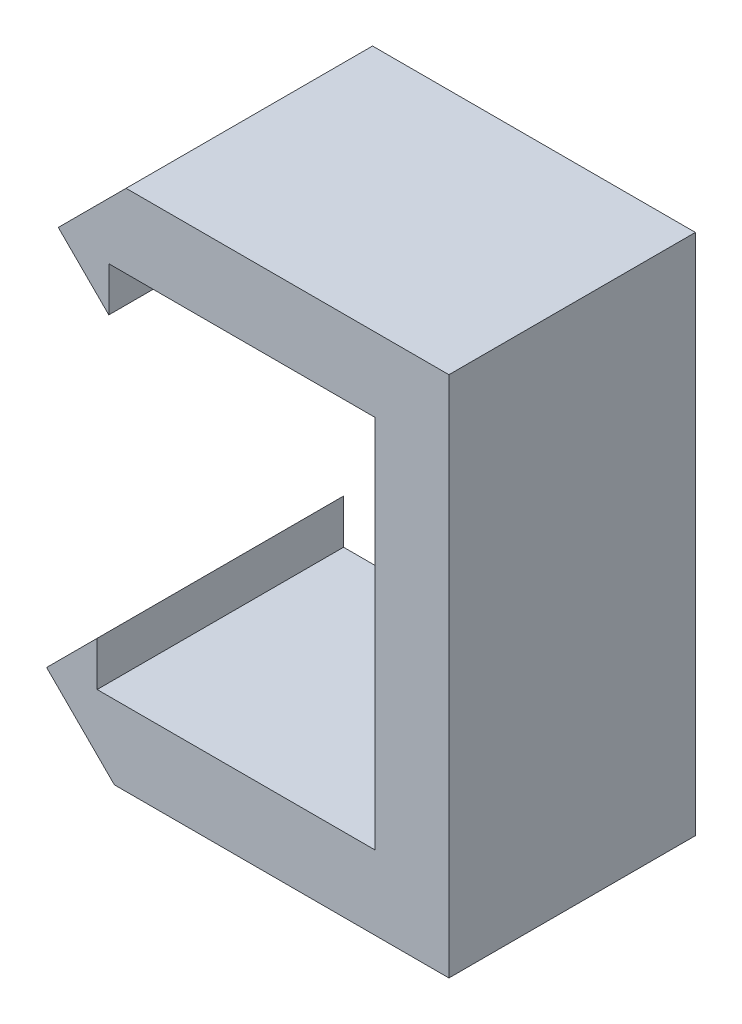
ISO-10303-21;
HEADER;
FILE_DESCRIPTION(('STEP AP214'),'2;1');
FILE_NAME('part.step','',(''),(''),'','','');
FILE_SCHEMA(('AUTOMOTIVE_DESIGN { 1 0 10303 214 1 1 1 1 }'));
ENDSEC;
DATA;
#1=APPLICATION_CONTEXT('core data for automotive mechanical design processes');
#2=APPLICATION_PROTOCOL_DEFINITION('international standard','automotive_design',2000,#1);
#3=PRODUCT_CONTEXT('',#1,'mechanical');
#4=PRODUCT('Part','Part','',(#3));
#5=PRODUCT_RELATED_PRODUCT_CATEGORY('part','',(#4));
#6=PRODUCT_DEFINITION_FORMATION('','',#4);
#7=PRODUCT_DEFINITION_CONTEXT('part definition',#1,'design');
#8=PRODUCT_DEFINITION('design','',#6,#7);
#9=PRODUCT_DEFINITION_SHAPE('','',#8);
#10=(LENGTH_UNIT() NAMED_UNIT(*) SI_UNIT(.MILLI.,.METRE.));
#11=(NAMED_UNIT(*) PLANE_ANGLE_UNIT() SI_UNIT($,.RADIAN.));
#12=(NAMED_UNIT(*) SI_UNIT($,.STERADIAN.) SOLID_ANGLE_UNIT());
#13=UNCERTAINTY_MEASURE_WITH_UNIT(LENGTH_MEASURE(1.E-05),#10,'distance_accuracy_value','');
#14=(GEOMETRIC_REPRESENTATION_CONTEXT(3) GLOBAL_UNCERTAINTY_ASSIGNED_CONTEXT((#13)) GLOBAL_UNIT_ASSIGNED_CONTEXT((#10,
#11,#12)) REPRESENTATION_CONTEXT('',''));
#15=CARTESIAN_POINT('',(0.,0.,0.));
#16=DIRECTION('',(0.,0.,1.));
#17=DIRECTION('',(1.,0.,0.));
#18=AXIS2_PLACEMENT_3D('',#15,#16,#17);
#19=CARTESIAN_POINT('',(-11.9544744209364,2.85150193237998,10.));
#20=DIRECTION('',(1.,0.,0.));
#21=DIRECTION('',(0.,1.,0.));
#22=AXIS2_PLACEMENT_3D('',#19,#20,#21);
#23=PLANE('',#22);
#24=DIRECTION('',(0.,-1.,0.));
#25=VECTOR('',#24,1.);
#26=CARTESIAN_POINT('',(-11.9544744209364,2.85150193237998,10.));
#27=LINE('',#26,#25);
#28=CARTESIAN_POINT('',(-11.9544744209364,3.1096578902488,10.));
#29=VERTEX_POINT('',#28);
#30=CARTESIAN_POINT('',(-11.9544744209364,1.3096578902488,10.));
#31=VERTEX_POINT('',#30);
#32=EDGE_CURVE('E137',#29,#31,#27,.T.);
#33=ORIENTED_EDGE('',*,*,#32,.T.);
#34=DIRECTION('',(0.,0.,1.));
#35=VECTOR('',#34,1.);
#36=CARTESIAN_POINT('',(-11.9544744209364,1.3096578902488,10.));
#37=LINE('',#36,#35);
#38=CARTESIAN_POINT('',(-11.9544744209364,1.3096578902488,0.));
#39=VERTEX_POINT('',#38);
#40=EDGE_CURVE('E239',#31,#39,#37,.F.);
#41=ORIENTED_EDGE('',*,*,#40,.T.);
#42=DIRECTION('',(0.,-1.,0.));
#43=VECTOR('',#42,1.);
#44=CARTESIAN_POINT('',(-11.9544744209364,2.85150193237998,0.));
#45=LINE('',#44,#43);
#46=CARTESIAN_POINT('',(-11.9544744209364,3.1096578902488,0.));
#47=VERTEX_POINT('',#46);
#48=EDGE_CURVE('E140',#47,#39,#45,.T.);
#49=ORIENTED_EDGE('',*,*,#48,.F.);
#50=DIRECTION('',(0.,0.,-1.));
#51=VECTOR('',#50,1.);
#52=CARTESIAN_POINT('',(-11.9544744209364,3.1096578902488,10.));
#53=LINE('',#52,#51);
#54=EDGE_CURVE('E135',#29,#47,#53,.T.);
#55=ORIENTED_EDGE('',*,*,#54,.F.);
#56=EDGE_LOOP('',(#33,#41,#49,#55));
#57=FACE_BOUND('',#56,.T.);
#58=ADVANCED_FACE('F16',(#57),#23,.T.);
#59=CARTESIAN_POINT('',(-6.16801259866785,3.1096578902488,10.));
#60=DIRECTION('',(0.,-1.,0.));
#61=DIRECTION('',(1.,0.,0.));
#62=AXIS2_PLACEMENT_3D('',#59,#60,#61);
#63=PLANE('',#62);
#64=DIRECTION('',(-1.,0.,0.));
#65=VECTOR('',#64,1.);
#66=CARTESIAN_POINT('',(-6.16801259866785,3.1096578902488,0.));
#67=LINE('',#66,#65);
#68=CARTESIAN_POINT('',(-1.15447442093638,3.1096578902488,0.));
#69=VERTEX_POINT('',#68);
#70=EDGE_CURVE('E192',#69,#47,#67,.T.);
#71=ORIENTED_EDGE('',*,*,#70,.F.);
#72=DIRECTION('',(0.,0.,-1.));
#73=VECTOR('',#72,1.);
#74=CARTESIAN_POINT('',(-1.15447442093638,3.1096578902488,10.));
#75=LINE('',#74,#73);
#76=CARTESIAN_POINT('',(-1.15447442093638,3.1096578902488,10.));
#77=VERTEX_POINT('',#76);
#78=EDGE_CURVE('E147',#77,#69,#75,.T.);
#79=ORIENTED_EDGE('',*,*,#78,.F.);
#80=DIRECTION('',(-1.,0.,0.));
#81=VECTOR('',#80,1.);
#82=CARTESIAN_POINT('',(-6.16801259866785,3.1096578902488,10.));
#83=LINE('',#82,#81);
#84=EDGE_CURVE('E152',#77,#29,#83,.T.);
#85=ORIENTED_EDGE('',*,*,#84,.T.);
#86=ORIENTED_EDGE('',*,*,#54,.T.);
#87=EDGE_LOOP('',(#71,#79,#85,#86));
#88=FACE_BOUND('',#87,.T.);
#89=ADVANCED_FACE('F158',(#88),#63,.T.);
#90=CARTESIAN_POINT('',(-1.15447442093637,-3.18937667277505,10.));
#91=DIRECTION('',(1.,0.,0.));
#92=DIRECTION('',(0.,1.,0.));
#93=AXIS2_PLACEMENT_3D('',#90,#91,#92);
#94=PLANE('',#93);
#95=DIRECTION('',(0.,-1.,0.));
#96=VECTOR('',#95,1.);
#97=CARTESIAN_POINT('',(-1.15447442093637,-3.18937667277505,0.));
#98=LINE('',#97,#96);
#99=CARTESIAN_POINT('',(-1.15447442093637,-12.0903421097512,0.));
#100=VERTEX_POINT('',#99);
#101=EDGE_CURVE('E194',#69,#100,#98,.T.);
#102=ORIENTED_EDGE('',*,*,#101,.T.);
#103=DIRECTION('',(0.,0.,-1.));
#104=VECTOR('',#103,1.);
#105=CARTESIAN_POINT('',(-1.15447442093637,-12.0903421097512,10.));
#106=LINE('',#105,#104);
#107=CARTESIAN_POINT('',(-1.15447442093637,-12.0903421097512,10.));
#108=VERTEX_POINT('',#107);
#109=EDGE_CURVE('E214',#108,#100,#106,.T.);
#110=ORIENTED_EDGE('',*,*,#109,.F.);
#111=DIRECTION('',(0.,-1.,0.));
#112=VECTOR('',#111,1.);
#113=CARTESIAN_POINT('',(-1.15447442093637,-3.18937667277505,10.));
#114=LINE('',#113,#112);
#115=EDGE_CURVE('E161',#77,#108,#114,.T.);
#116=ORIENTED_EDGE('',*,*,#115,.F.);
#117=ORIENTED_EDGE('',*,*,#78,.T.);
#118=EDGE_LOOP('',(#102,#110,#116,#117));
#119=FACE_BOUND('',#118,.T.);
#120=ADVANCED_FACE('F301',(#119),#94,.F.);
#121=CARTESIAN_POINT('',(-6.40506942601482,-12.0903421097512,10.));
#122=DIRECTION('',(0.,-1.,0.));
#123=DIRECTION('',(0.,0.,-1.));
#124=AXIS2_PLACEMENT_3D('',#121,#122,#123);
#125=PLANE('',#124);
#126=DIRECTION('',(-1.,0.,0.));
#127=VECTOR('',#126,1.);
#128=CARTESIAN_POINT('',(-6.40506942601482,-12.0903421097512,0.));
#129=LINE('',#128,#127);
#130=CARTESIAN_POINT('',(-12.4285880756303,-12.0903421097512,0.));
#131=VERTEX_POINT('',#130);
#132=EDGE_CURVE('E204',#100,#131,#129,.T.);
#133=ORIENTED_EDGE('',*,*,#132,.T.);
#134=DIRECTION('',(0.,0.,-1.));
#135=VECTOR('',#134,1.);
#136=CARTESIAN_POINT('',(-12.4285880756303,-12.0903421097512,10.));
#137=LINE('',#136,#135);
#138=CARTESIAN_POINT('',(-12.4285880756303,-12.0903421097512,10.));
#139=VERTEX_POINT('',#138);
#140=EDGE_CURVE('E210',#139,#131,#137,.T.);
#141=ORIENTED_EDGE('',*,*,#140,.F.);
#142=DIRECTION('',(-1.,0.,0.));
#143=VECTOR('',#142,1.);
#144=CARTESIAN_POINT('',(-6.40506942601482,-12.0903421097512,10.));
#145=LINE('',#144,#143);
#146=EDGE_CURVE('E178',#108,#139,#145,.T.);
#147=ORIENTED_EDGE('',*,*,#146,.F.);
#148=ORIENTED_EDGE('',*,*,#109,.T.);
#149=EDGE_LOOP('',(#133,#141,#147,#148));
#150=FACE_BOUND('',#149,.T.);
#151=ADVANCED_FACE('F298',(#150),#125,.F.);
#152=CARTESIAN_POINT('',(-12.4285880756303,-12.8696809486542,10.));
#153=DIRECTION('',(-1.,0.,0.));
#154=DIRECTION('',(0.,-1.,0.));
#155=AXIS2_PLACEMENT_3D('',#152,#153,#154);
#156=PLANE('',#155);
#157=DIRECTION('',(0.,1.,0.));
#158=VECTOR('',#157,1.);
#159=CARTESIAN_POINT('',(-12.4285880756303,-12.8696809486542,0.));
#160=LINE('',#159,#158);
#161=CARTESIAN_POINT('',(-12.4285880756303,-10.2903421097512,0.));
#162=VERTEX_POINT('',#161);
#163=EDGE_CURVE('E156',#131,#162,#160,.T.);
#164=ORIENTED_EDGE('',*,*,#163,.T.);
#165=DIRECTION('',(0.,0.,-1.));
#166=VECTOR('',#165,1.);
#167=CARTESIAN_POINT('',(-12.4285880756303,-10.2903421097512,10.));
#168=LINE('',#167,#166);
#169=CARTESIAN_POINT('',(-12.4285880756303,-10.2903421097512,10.));
#170=VERTEX_POINT('',#169);
#171=EDGE_CURVE('E231',#162,#170,#168,.F.);
#172=ORIENTED_EDGE('',*,*,#171,.T.);
#173=DIRECTION('',(0.,1.,0.));
#174=VECTOR('',#173,1.);
#175=CARTESIAN_POINT('',(-12.4285880756303,-12.8696809486542,10.));
#176=LINE('',#175,#174);
#177=EDGE_CURVE('E181',#139,#170,#176,.T.);
#178=ORIENTED_EDGE('',*,*,#177,.F.);
#179=ORIENTED_EDGE('',*,*,#140,.T.);
#180=EDGE_LOOP('',(#164,#172,#178,#179));
#181=FACE_BOUND('',#180,.T.);
#182=ADVANCED_FACE('F293',(#181),#156,.F.);
#183=CARTESIAN_POINT('',(5.77486027864381,-15.0903421097512,10.));
#184=DIRECTION('',(0.,1.,0.));
#185=DIRECTION('',(0.,0.,1.));
#186=AXIS2_PLACEMENT_3D('',#183,#184,#185);
#187=PLANE('',#186);
#188=DIRECTION('',(1.,0.,0.));
#189=VECTOR('',#188,1.);
#190=CARTESIAN_POINT('',(5.77486027864381,-15.0903421097512,10.));
#191=LINE('',#190,#189);
#192=CARTESIAN_POINT('',(-11.7285880756303,-15.0903421097512,10.));
#193=VERTEX_POINT('',#192);
#194=CARTESIAN_POINT('',(1.84552557906362,-15.0903421097512,10.));
#195=VERTEX_POINT('',#194);
#196=EDGE_CURVE('E167',#193,#195,#191,.T.);
#197=ORIENTED_EDGE('',*,*,#196,.F.);
#198=DIRECTION('',(0.,0.,-1.));
#199=VECTOR('',#198,1.);
#200=CARTESIAN_POINT('',(-11.7285880756303,-15.0903421097512,0.));
#201=LINE('',#200,#199);
#202=CARTESIAN_POINT('',(-11.7285880756303,-15.0903421097512,0.));
#203=VERTEX_POINT('',#202);
#204=EDGE_CURVE('E242',#193,#203,#201,.T.);
#205=ORIENTED_EDGE('',*,*,#204,.T.);
#206=DIRECTION('',(1.,0.,0.));
#207=VECTOR('',#206,1.);
#208=CARTESIAN_POINT('',(5.77486027864381,-15.0903421097512,0.));
#209=LINE('',#208,#207);
#210=CARTESIAN_POINT('',(1.84552557906362,-15.0903421097512,0.));
#211=VERTEX_POINT('',#210);
#212=EDGE_CURVE('E197',#203,#211,#209,.T.);
#213=ORIENTED_EDGE('',*,*,#212,.T.);
#214=DIRECTION('',(0.,0.,-1.));
#215=VECTOR('',#214,1.);
#216=CARTESIAN_POINT('',(1.84552557906362,-15.0903421097512,10.));
#217=LINE('',#216,#215);
#218=EDGE_CURVE('E215',#195,#211,#217,.T.);
#219=ORIENTED_EDGE('',*,*,#218,.F.);
#220=EDGE_LOOP('',(#197,#205,#213,#219));
#221=FACE_BOUND('',#220,.T.);
#222=ADVANCED_FACE('F279',(#221),#187,.F.);
#223=CARTESIAN_POINT('',(1.84552557906362,-2.38937667277505,10.));
#224=DIRECTION('',(1.,0.,0.));
#225=DIRECTION('',(0.,1.,0.));
#226=AXIS2_PLACEMENT_3D('',#223,#224,#225);
#227=PLANE('',#226);
#228=DIRECTION('',(0.,-1.,0.));
#229=VECTOR('',#228,1.);
#230=CARTESIAN_POINT('',(1.84552557906362,-2.38937667277505,0.));
#231=LINE('',#230,#229);
#232=CARTESIAN_POINT('',(1.84552557906362,6.1096578902488,0.));
#233=VERTEX_POINT('',#232);
#234=EDGE_CURVE('E200',#233,#211,#231,.T.);
#235=ORIENTED_EDGE('',*,*,#234,.F.);
#236=DIRECTION('',(0.,0.,-1.));
#237=VECTOR('',#236,1.);
#238=CARTESIAN_POINT('',(1.84552557906362,6.1096578902488,10.));
#239=LINE('',#238,#237);
#240=CARTESIAN_POINT('',(1.84552557906362,6.1096578902488,10.));
#241=VERTEX_POINT('',#240);
#242=EDGE_CURVE('E185',#241,#233,#239,.T.);
#243=ORIENTED_EDGE('',*,*,#242,.F.);
#244=DIRECTION('',(0.,-1.,0.));
#245=VECTOR('',#244,1.);
#246=CARTESIAN_POINT('',(1.84552557906362,-2.38937667277505,10.));
#247=LINE('',#246,#245);
#248=EDGE_CURVE('E174',#241,#195,#247,.T.);
#249=ORIENTED_EDGE('',*,*,#248,.T.);
#250=ORIENTED_EDGE('',*,*,#218,.T.);
#251=EDGE_LOOP('',(#235,#243,#249,#250));
#252=FACE_BOUND('',#251,.T.);
#253=ADVANCED_FACE('F276',(#252),#227,.T.);
#254=CARTESIAN_POINT('',(-6.16801259866785,6.1096578902488,10.));
#255=DIRECTION('',(0.,-1.,0.));
#256=DIRECTION('',(1.,0.,0.));
#257=AXIS2_PLACEMENT_3D('',#254,#255,#256);
#258=PLANE('',#257);
#259=DIRECTION('',(-1.,0.,0.));
#260=VECTOR('',#259,1.);
#261=CARTESIAN_POINT('',(-6.16801259866785,6.1096578902488,0.));
#262=LINE('',#261,#260);
#263=CARTESIAN_POINT('',(-11.2544744209364,6.1096578902488,0.));
#264=VERTEX_POINT('',#263);
#265=EDGE_CURVE('E188',#233,#264,#262,.T.);
#266=ORIENTED_EDGE('',*,*,#265,.T.);
#267=DIRECTION('',(0.,0.,1.));
#268=VECTOR('',#267,1.);
#269=CARTESIAN_POINT('',(-11.2544744209364,6.1096578902488,10.));
#270=LINE('',#269,#268);
#271=CARTESIAN_POINT('',(-11.2544744209364,6.1096578902488,10.));
#272=VERTEX_POINT('',#271);
#273=EDGE_CURVE('E10',#264,#272,#270,.T.);
#274=ORIENTED_EDGE('',*,*,#273,.T.);
#275=DIRECTION('',(-1.,0.,0.));
#276=VECTOR('',#275,1.);
#277=CARTESIAN_POINT('',(-6.16801259866785,6.1096578902488,10.));
#278=LINE('',#277,#276);
#279=EDGE_CURVE('E155',#241,#272,#278,.T.);
#280=ORIENTED_EDGE('',*,*,#279,.F.);
#281=ORIENTED_EDGE('',*,*,#242,.T.);
#282=EDGE_LOOP('',(#266,#274,#280,#281));
#283=FACE_BOUND('',#282,.T.);
#284=ADVANCED_FACE('F270',(#283),#258,.F.);
#285=CARTESIAN_POINT('',(-6.69153124828334,-4.4903421097512,10.));
#286=DIRECTION('',(0.,0.,1.));
#287=DIRECTION('',(1.,0.,0.));
#288=AXIS2_PLACEMENT_3D('',#285,#286,#287);
#289=PLANE('',#288);
#290=DIRECTION('',(0.707106781186548,0.707106781186548,0.));
#291=VECTOR('',#290,1.);
#292=CARTESIAN_POINT('',(-6.66005966195683,-4.52181369607771,10.));
#293=LINE('',#292,#291);
#294=CARTESIAN_POINT('',(-14.4785880756303,-12.3403421097512,10.));
#295=VERTEX_POINT('',#294);
#296=EDGE_CURVE('E236',#170,#295,#293,.F.);
#297=ORIENTED_EDGE('',*,*,#296,.T.);
#298=DIRECTION('',(0.707106781186547,-0.707106781186548,0.));
#299=VECTOR('',#298,1.);
#300=CARTESIAN_POINT('',(-14.5100596619568,-12.3088705234247,10.));
#301=LINE('',#300,#299);
#302=EDGE_CURVE('E256',#295,#193,#301,.T.);
#303=ORIENTED_EDGE('',*,*,#302,.T.);
#304=ORIENTED_EDGE('',*,*,#196,.T.);
#305=ORIENTED_EDGE('',*,*,#248,.F.);
#306=ORIENTED_EDGE('',*,*,#279,.T.);
#307=DIRECTION('',(0.707106781186548,0.707106781186548,0.));
#308=VECTOR('',#307,1.);
#309=CARTESIAN_POINT('',(-14.2730028346099,3.09112947657532,10.));
#310=LINE('',#309,#308);
#311=CARTESIAN_POINT('',(-14.0044744209364,3.3596578902488,10.));
#312=VERTEX_POINT('',#311);
#313=EDGE_CURVE('E37',#272,#312,#310,.F.);
#314=ORIENTED_EDGE('',*,*,#313,.T.);
#315=DIRECTION('',(-0.707106781186548,0.707106781186548,0.));
#316=VECTOR('',#315,1.);
#317=CARTESIAN_POINT('',(-6.42300283460986,-4.22181369607771,10.));
#318=LINE('',#317,#316);
#319=EDGE_CURVE('E153',#312,#31,#318,.F.);
#320=ORIENTED_EDGE('',*,*,#319,.T.);
#321=ORIENTED_EDGE('',*,*,#32,.F.);
#322=ORIENTED_EDGE('',*,*,#84,.F.);
#323=ORIENTED_EDGE('',*,*,#115,.T.);
#324=ORIENTED_EDGE('',*,*,#146,.T.);
#325=ORIENTED_EDGE('',*,*,#177,.T.);
#326=EDGE_LOOP('',(#297,#303,#304,#305,#306,#314,#320,#321,#322,#323,#324,#325));
#327=FACE_BOUND('',#326,.T.);
#328=ADVANCED_FACE('F151',(#327),#289,.T.);
#329=CARTESIAN_POINT('',(-6.69153124828334,-4.4903421097512,0.));
#330=DIRECTION('',(0.,0.,1.));
#331=DIRECTION('',(1.,0.,0.));
#332=AXIS2_PLACEMENT_3D('',#329,#330,#331);
#333=PLANE('',#332);
#334=ORIENTED_EDGE('',*,*,#212,.F.);
#335=DIRECTION('',(-0.707106781186547,0.707106781186548,0.));
#336=VECTOR('',#335,1.);
#337=CARTESIAN_POINT('',(-11.7285880756303,-15.0903421097512,0.));
#338=LINE('',#337,#336);
#339=CARTESIAN_POINT('',(-14.4785880756303,-12.3403421097512,0.));
#340=VERTEX_POINT('',#339);
#341=EDGE_CURVE('E248',#203,#340,#338,.T.);
#342=ORIENTED_EDGE('',*,*,#341,.T.);
#343=DIRECTION('',(-0.707106781186548,-0.707106781186548,0.));
#344=VECTOR('',#343,1.);
#345=CARTESIAN_POINT('',(-15.2285880756303,-13.0903421097512,0.));
#346=LINE('',#345,#344);
#347=EDGE_CURVE('E228',#340,#162,#346,.F.);
#348=ORIENTED_EDGE('',*,*,#347,.T.);
#349=ORIENTED_EDGE('',*,*,#163,.F.);
#350=ORIENTED_EDGE('',*,*,#132,.F.);
#351=ORIENTED_EDGE('',*,*,#101,.F.);
#352=ORIENTED_EDGE('',*,*,#70,.T.);
#353=ORIENTED_EDGE('',*,*,#48,.T.);
#354=DIRECTION('',(0.707106781186548,-0.707106781186548,0.));
#355=VECTOR('',#354,1.);
#356=CARTESIAN_POINT('',(-11.7544744209364,1.1096578902488,0.));
#357=LINE('',#356,#355);
#358=CARTESIAN_POINT('',(-14.0044744209364,3.3596578902488,0.));
#359=VERTEX_POINT('',#358);
#360=EDGE_CURVE('E146',#39,#359,#357,.F.);
#361=ORIENTED_EDGE('',*,*,#360,.T.);
#362=DIRECTION('',(-0.707106781186548,-0.707106781186548,0.));
#363=VECTOR('',#362,1.);
#364=CARTESIAN_POINT('',(-14.7544744209364,2.6096578902488,0.));
#365=LINE('',#364,#363);
#366=EDGE_CURVE('E245',#359,#264,#365,.F.);
#367=ORIENTED_EDGE('',*,*,#366,.T.);
#368=ORIENTED_EDGE('',*,*,#265,.F.);
#369=ORIENTED_EDGE('',*,*,#234,.T.);
#370=EDGE_LOOP('',(#334,#342,#348,#349,#350,#351,#352,#353,#361,#367,#368,#369));
#371=FACE_BOUND('',#370,.T.);
#372=ADVANCED_FACE('F266',(#371),#333,.F.);
#373=CARTESIAN_POINT('',(-15.2285880756303,-13.0903421097512,10.));
#374=DIRECTION('',(0.707106781186548,-0.707106781186548,0.));
#375=DIRECTION('',(0.,0.,-1.));
#376=AXIS2_PLACEMENT_3D('',#373,#374,#375);
#377=PLANE('',#376);
#378=ORIENTED_EDGE('',*,*,#347,.F.);
#379=DIRECTION('',(0.,0.,-1.));
#380=VECTOR('',#379,1.);
#381=CARTESIAN_POINT('',(-14.4785880756303,-12.3403421097512,10.));
#382=LINE('',#381,#380);
#383=EDGE_CURVE('E251',#340,#295,#382,.F.);
#384=ORIENTED_EDGE('',*,*,#383,.T.);
#385=ORIENTED_EDGE('',*,*,#296,.F.);
#386=ORIENTED_EDGE('',*,*,#171,.F.);
#387=EDGE_LOOP('',(#378,#384,#385,#386));
#388=FACE_BOUND('',#387,.T.);
#389=ADVANCED_FACE('F287',(#388),#377,.F.);
#390=CARTESIAN_POINT('',(-11.7544744209364,1.1096578902488,10.));
#391=DIRECTION('',(0.707106781186548,0.707106781186548,0.));
#392=DIRECTION('',(0.,0.,-1.));
#393=AXIS2_PLACEMENT_3D('',#390,#391,#392);
#394=PLANE('',#393);
#395=ORIENTED_EDGE('',*,*,#319,.F.);
#396=DIRECTION('',(0.,0.,-1.));
#397=VECTOR('',#396,1.);
#398=CARTESIAN_POINT('',(-14.0044744209364,3.3596578902488,10.));
#399=LINE('',#398,#397);
#400=EDGE_CURVE('E25',#312,#359,#399,.T.);
#401=ORIENTED_EDGE('',*,*,#400,.T.);
#402=ORIENTED_EDGE('',*,*,#360,.F.);
#403=ORIENTED_EDGE('',*,*,#40,.F.);
#404=EDGE_LOOP('',(#395,#401,#402,#403));
#405=FACE_BOUND('',#404,.T.);
#406=ADVANCED_FACE('F262',(#405),#394,.F.);
#407=CARTESIAN_POINT('',(-11.7285880756303,-15.0903421097512,10.));
#408=DIRECTION('',(-0.707106781186548,-0.707106781186547,0.));
#409=DIRECTION('',(0.,0.,1.));
#410=AXIS2_PLACEMENT_3D('',#407,#408,#409);
#411=PLANE('',#410);
#412=ORIENTED_EDGE('',*,*,#302,.F.);
#413=ORIENTED_EDGE('',*,*,#383,.F.);
#414=ORIENTED_EDGE('',*,*,#341,.F.);
#415=ORIENTED_EDGE('',*,*,#204,.F.);
#416=EDGE_LOOP('',(#412,#413,#414,#415));
#417=FACE_BOUND('',#416,.T.);
#418=ADVANCED_FACE('F283',(#417),#411,.T.);
#419=CARTESIAN_POINT('',(-14.7544744209364,2.6096578902488,10.));
#420=DIRECTION('',(0.707106781186547,-0.707106781186548,0.));
#421=DIRECTION('',(0.,0.,-1.));
#422=AXIS2_PLACEMENT_3D('',#419,#420,#421);
#423=PLANE('',#422);
#424=ORIENTED_EDGE('',*,*,#313,.F.);
#425=ORIENTED_EDGE('',*,*,#273,.F.);
#426=ORIENTED_EDGE('',*,*,#366,.F.);
#427=ORIENTED_EDGE('',*,*,#400,.F.);
#428=EDGE_LOOP('',(#424,#425,#426,#427));
#429=FACE_BOUND('',#428,.T.);
#430=ADVANCED_FACE('F18',(#429),#423,.F.);
#431=CLOSED_SHELL('',(#58,#89,#120,#151,#182,#222,#253,#284,#328,#372,#389,#406,#418,#430));
#432=MANIFOLD_SOLID_BREP('B1',#431);
#433=ADVANCED_BREP_SHAPE_REPRESENTATION('',(#18,#432),#14);
#434=SHAPE_DEFINITION_REPRESENTATION(#9,#433);
ENDSEC;
END-ISO-10303-21;
